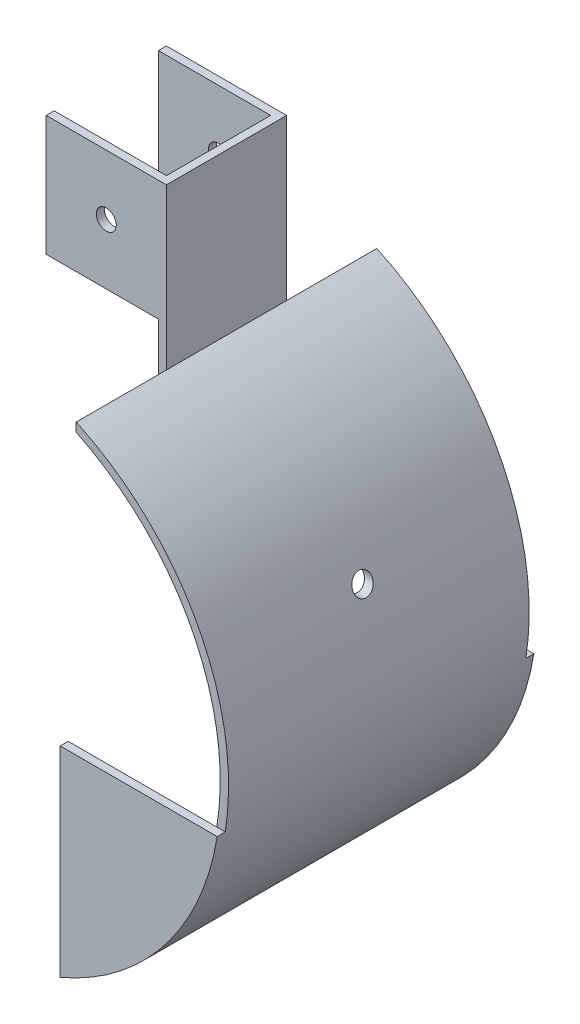
ISO-10303-21;
HEADER;
FILE_DESCRIPTION(('STEP AP214'),'2;1');
FILE_NAME('part.step','',(''),(''),'','','');
FILE_SCHEMA(('AUTOMOTIVE_DESIGN { 1 0 10303 214 1 1 1 1 }'));
ENDSEC;
DATA;
#1=APPLICATION_CONTEXT('core data for automotive mechanical design processes');
#2=APPLICATION_PROTOCOL_DEFINITION('international standard','automotive_design',2000,#1);
#3=PRODUCT_CONTEXT('',#1,'mechanical');
#4=PRODUCT('Part','Part','',(#3));
#5=PRODUCT_RELATED_PRODUCT_CATEGORY('part','',(#4));
#6=PRODUCT_DEFINITION_FORMATION('','',#4);
#7=PRODUCT_DEFINITION_CONTEXT('part definition',#1,'design');
#8=PRODUCT_DEFINITION('design','',#6,#7);
#9=PRODUCT_DEFINITION_SHAPE('','',#8);
#10=(LENGTH_UNIT() NAMED_UNIT(*) SI_UNIT(.MILLI.,.METRE.));
#11=(NAMED_UNIT(*) PLANE_ANGLE_UNIT() SI_UNIT($,.RADIAN.));
#12=(NAMED_UNIT(*) SI_UNIT($,.STERADIAN.) SOLID_ANGLE_UNIT());
#13=UNCERTAINTY_MEASURE_WITH_UNIT(LENGTH_MEASURE(1.E-05),#10,'distance_accuracy_value','');
#14=(GEOMETRIC_REPRESENTATION_CONTEXT(3) GLOBAL_UNCERTAINTY_ASSIGNED_CONTEXT((#13)) GLOBAL_UNIT_ASSIGNED_CONTEXT((#10,
#11,#12)) REPRESENTATION_CONTEXT('',''));
#15=CARTESIAN_POINT('',(0.,0.,0.));
#16=DIRECTION('',(0.,0.,1.));
#17=DIRECTION('',(1.,0.,0.));
#18=AXIS2_PLACEMENT_3D('',#15,#16,#17);
#19=CARTESIAN_POINT('',(0.,0.,0.));
#20=DIRECTION('',(0.,0.,1.));
#21=DIRECTION('',(1.,0.,0.));
#22=AXIS2_PLACEMENT_3D('',#19,#20,#21);
#23=PLANE('',#22);
#24=DIRECTION('',(1.,0.,0.));
#25=VECTOR('',#24,1.);
#26=CARTESIAN_POINT('',(13.,-94.9833321757651,6.93889390390723E-13));
#27=LINE('',#26,#25);
#28=CARTESIAN_POINT('',(50.0664199888695,-94.9833321757651,0.));
#29=VERTEX_POINT('',#28);
#30=CARTESIAN_POINT('',(52.1743790271769,-94.9833321757651,6.93889390390723E-13));
#31=VERTEX_POINT('',#30);
#32=EDGE_CURVE('E13',#29,#31,#27,.T.);
#33=ORIENTED_EDGE('',*,*,#32,.F.);
#34=CARTESIAN_POINT('',(-12.7808753095954,-84.5463493161086,0.));
#35=DIRECTION('',(0.,0.,1.));
#36=DIRECTION('',(1.,0.,0.));
#37=AXIS2_PLACEMENT_3D('',#34,#35,#36);
#38=CIRCLE('',#37,63.7080304007683);
#39=CARTESIAN_POINT('',(15.,-27.214542222856,0.));
#40=VERTEX_POINT('',#39);
#41=EDGE_CURVE('E346',#40,#29,#38,.F.);
#42=ORIENTED_EDGE('',*,*,#41,.F.);
#43=DIRECTION('',(0.,-1.,0.));
#44=VECTOR('',#43,1.);
#45=CARTESIAN_POINT('',(15.,0.,0.));
#46=LINE('',#45,#44);
#47=CARTESIAN_POINT('',(15.,-25.,0.));
#48=VERTEX_POINT('',#47);
#49=EDGE_CURVE('E376',#48,#40,#46,.T.);
#50=ORIENTED_EDGE('',*,*,#49,.F.);
#51=CARTESIAN_POINT('',(-12.6410256410256,-84.547587311974,0.));
#52=DIRECTION('',(0.,0.,1.));
#53=DIRECTION('',(1.,0.,0.));
#54=AXIS2_PLACEMENT_3D('',#51,#52,#53);
#55=CIRCLE('',#54,65.6501443499175);
#56=EDGE_CURVE('E71',#48,#31,#55,.F.);
#57=ORIENTED_EDGE('',*,*,#56,.T.);
#58=EDGE_LOOP('',(#33,#42,#50,#57));
#59=FACE_BOUND('',#58,.T.);
#60=ADVANCED_FACE('F46',(#59),#23,.F.);
#61=DIRECTION('',(0.,1.,0.));
#62=VECTOR('',#61,1.);
#63=CARTESIAN_POINT('',(13.,-144.983332175765,6.93889390390723E-13));
#64=LINE('',#63,#62);
#65=CARTESIAN_POINT('',(13.,-144.983332175765,6.93889390390723E-13));
#66=VERTEX_POINT('',#65);
#67=CARTESIAN_POINT('',(13.,-142.804907535621,6.93889390390723E-13));
#68=VERTEX_POINT('',#67);
#69=EDGE_CURVE('E540',#66,#68,#64,.T.);
#70=ORIENTED_EDGE('',*,*,#69,.F.);
#71=DIRECTION('',(-0.432481400809794,0.90164285498949,0.));
#72=VECTOR('',#71,1.);
#73=CARTESIAN_POINT('',(-45.9668685110869,-22.0484369997544,6.93889390390723E-13));
#74=LINE('',#73,#72);
#75=CARTESIAN_POINT('',(12.1350371983804,-143.180046465786,0.));
#76=VERTEX_POINT('',#75);
#77=EDGE_CURVE('E337',#66,#76,#74,.T.);
#78=ORIENTED_EDGE('',*,*,#77,.T.);
#79=EDGE_CURVE('E345',#68,#76,#38,.F.);
#80=ORIENTED_EDGE('',*,*,#79,.F.);
#81=EDGE_LOOP('',(#70,#78,#80));
#82=FACE_BOUND('',#81,.T.);
#83=ADVANCED_FACE('F408',(#82),#23,.F.);
#84=CARTESIAN_POINT('',(0.,0.,75.));
#85=DIRECTION('',(0.,0.,1.));
#86=DIRECTION('',(1.,0.,0.));
#87=AXIS2_PLACEMENT_3D('',#84,#85,#86);
#88=PLANE('',#87);
#89=DIRECTION('',(0.,-1.,0.));
#90=VECTOR('',#89,1.);
#91=CARTESIAN_POINT('',(13.,-144.983332175765,75.));
#92=LINE('',#91,#90);
#93=CARTESIAN_POINT('',(13.,-142.804907535621,75.));
#94=VERTEX_POINT('',#93);
#95=CARTESIAN_POINT('',(13.,-144.983332175765,75.));
#96=VERTEX_POINT('',#95);
#97=EDGE_CURVE('E59',#94,#96,#92,.T.);
#98=ORIENTED_EDGE('',*,*,#97,.F.);
#99=CARTESIAN_POINT('',(-12.7808753095955,-84.5463493161086,75.));
#100=DIRECTION('',(0.,0.,1.));
#101=DIRECTION('',(1.,0.,0.));
#102=AXIS2_PLACEMENT_3D('',#99,#100,#101);
#103=CIRCLE('',#102,63.7080304007683);
#104=CARTESIAN_POINT('',(12.1350371983804,-143.180046465786,75.));
#105=VERTEX_POINT('',#104);
#106=EDGE_CURVE('E336',#94,#105,#103,.F.);
#107=ORIENTED_EDGE('',*,*,#106,.T.);
#108=DIRECTION('',(-0.432481400809794,0.90164285498949,0.));
#109=VECTOR('',#108,1.);
#110=CARTESIAN_POINT('',(-45.9668685110869,-22.0484369997544,75.));
#111=LINE('',#110,#109);
#112=EDGE_CURVE('E340',#96,#105,#111,.T.);
#113=ORIENTED_EDGE('',*,*,#112,.F.);
#114=EDGE_LOOP('',(#98,#107,#113));
#115=FACE_BOUND('',#114,.T.);
#116=ADVANCED_FACE('F413',(#115),#88,.T.);
#117=CARTESIAN_POINT('',(0.,15.,75.));
#118=DIRECTION('',(0.,1.,0.));
#119=DIRECTION('',(0.,0.,1.));
#120=AXIS2_PLACEMENT_3D('',#117,#118,#119);
#121=PLANE('',#120);
#122=DIRECTION('',(0.,0.,-1.));
#123=VECTOR('',#122,1.);
#124=CARTESIAN_POINT('',(-15.,15.,75.0000000000007));
#125=LINE('',#124,#123);
#126=CARTESIAN_POINT('',(-15.,15.,24.5000000000007));
#127=VERTEX_POINT('',#126);
#128=CARTESIAN_POINT('',(-15.,15.,22.5000000000007));
#129=VERTEX_POINT('',#128);
#130=EDGE_CURVE('E367',#127,#129,#125,.T.);
#131=ORIENTED_EDGE('',*,*,#130,.F.);
#132=DIRECTION('',(1.,0.,0.));
#133=VECTOR('',#132,1.);
#134=CARTESIAN_POINT('',(0.,15.,24.5));
#135=LINE('',#134,#133);
#136=CARTESIAN_POINT('',(13.,15.,24.5000000000007));
#137=VERTEX_POINT('',#136);
#138=EDGE_CURVE('E285',#127,#137,#135,.T.);
#139=ORIENTED_EDGE('',*,*,#138,.T.);
#140=DIRECTION('',(0.,0.,1.));
#141=VECTOR('',#140,1.);
#142=CARTESIAN_POINT('',(13.,15.,75.));
#143=LINE('',#142,#141);
#144=CARTESIAN_POINT('',(13.,15.,50.5000000000007));
#145=VERTEX_POINT('',#144);
#146=EDGE_CURVE('E288',#137,#145,#143,.T.);
#147=ORIENTED_EDGE('',*,*,#146,.T.);
#148=DIRECTION('',(1.,0.,0.));
#149=VECTOR('',#148,1.);
#150=CARTESIAN_POINT('',(0.,15.,50.5));
#151=LINE('',#150,#149);
#152=CARTESIAN_POINT('',(-15.,15.,50.5000000000007));
#153=VERTEX_POINT('',#152);
#154=EDGE_CURVE('E280',#153,#145,#151,.T.);
#155=ORIENTED_EDGE('',*,*,#154,.F.);
#156=CARTESIAN_POINT('',(-15.,15.,52.5000000000007));
#157=VERTEX_POINT('',#156);
#158=EDGE_CURVE('E368',#157,#153,#125,.T.);
#159=ORIENTED_EDGE('',*,*,#158,.F.);
#160=DIRECTION('',(1.,0.,0.));
#161=VECTOR('',#160,1.);
#162=CARTESIAN_POINT('',(0.,15.,52.5));
#163=LINE('',#162,#161);
#164=CARTESIAN_POINT('',(15.,15.,52.5));
#165=VERTEX_POINT('',#164);
#166=EDGE_CURVE('E291',#157,#165,#163,.T.);
#167=ORIENTED_EDGE('',*,*,#166,.T.);
#168=DIRECTION('',(0.,0.,-1.));
#169=VECTOR('',#168,1.);
#170=CARTESIAN_POINT('',(15.,15.,75.));
#171=LINE('',#170,#169);
#172=CARTESIAN_POINT('',(15.,15.,22.5));
#173=VERTEX_POINT('',#172);
#174=EDGE_CURVE('E371',#165,#173,#171,.T.);
#175=ORIENTED_EDGE('',*,*,#174,.T.);
#176=DIRECTION('',(1.,0.,0.));
#177=VECTOR('',#176,1.);
#178=CARTESIAN_POINT('',(0.,15.,22.5));
#179=LINE('',#178,#177);
#180=EDGE_CURVE('E309',#129,#173,#179,.T.);
#181=ORIENTED_EDGE('',*,*,#180,.F.);
#182=EDGE_LOOP('',(#131,#139,#147,#155,#159,#167,#175,#181));
#183=FACE_BOUND('',#182,.T.);
#184=ADVANCED_FACE('F497',(#183),#121,.T.);
#185=CARTESIAN_POINT('',(-15.,0.,75.0000000000007));
#186=DIRECTION('',(-1.,0.,0.));
#187=DIRECTION('',(0.,0.,1.));
#188=AXIS2_PLACEMENT_3D('',#185,#186,#187);
#189=PLANE('',#188);
#190=DIRECTION('',(0.,0.,-1.));
#191=VECTOR('',#190,1.);
#192=CARTESIAN_POINT('',(-15.,-15.,75.0000000000007));
#193=LINE('',#192,#191);
#194=CARTESIAN_POINT('',(-15.,-15.,24.5000000000007));
#195=VERTEX_POINT('',#194);
#196=CARTESIAN_POINT('',(-15.,-15.,22.5000000000007));
#197=VERTEX_POINT('',#196);
#198=EDGE_CURVE('E363',#195,#197,#193,.T.);
#199=ORIENTED_EDGE('',*,*,#198,.F.);
#200=DIRECTION('',(0.,1.,0.));
#201=VECTOR('',#200,1.);
#202=CARTESIAN_POINT('',(-15.,0.,24.5000000000007));
#203=LINE('',#202,#201);
#204=EDGE_CURVE('E271',#195,#127,#203,.T.);
#205=ORIENTED_EDGE('',*,*,#204,.T.);
#206=ORIENTED_EDGE('',*,*,#130,.T.);
#207=DIRECTION('',(0.,1.,0.));
#208=VECTOR('',#207,1.);
#209=CARTESIAN_POINT('',(-15.,-60.,22.5000000000007));
#210=LINE('',#209,#208);
#211=EDGE_CURVE('E312',#197,#129,#210,.T.);
#212=ORIENTED_EDGE('',*,*,#211,.F.);
#213=EDGE_LOOP('',(#199,#205,#206,#212));
#214=FACE_BOUND('',#213,.T.);
#215=ADVANCED_FACE('F506',(#214),#189,.T.);
#216=CARTESIAN_POINT('',(0.,-15.,75.));
#217=DIRECTION('',(0.,1.,0.));
#218=DIRECTION('',(0.,0.,1.));
#219=AXIS2_PLACEMENT_3D('',#216,#217,#218);
#220=PLANE('',#219);
#221=DIRECTION('',(1.,0.,0.));
#222=VECTOR('',#221,1.);
#223=CARTESIAN_POINT('',(0.,-15.,24.5));
#224=LINE('',#223,#222);
#225=CARTESIAN_POINT('',(13.,-15.,24.5000000000007));
#226=VERTEX_POINT('',#225);
#227=EDGE_CURVE('E282',#195,#226,#224,.T.);
#228=ORIENTED_EDGE('',*,*,#227,.F.);
#229=ORIENTED_EDGE('',*,*,#198,.T.);
#230=DIRECTION('',(1.,0.,0.));
#231=VECTOR('',#230,1.);
#232=CARTESIAN_POINT('',(0.,-15.,22.5));
#233=LINE('',#232,#231);
#234=CARTESIAN_POINT('',(13.,-15.,22.5000000000007));
#235=VERTEX_POINT('',#234);
#236=EDGE_CURVE('E330',#197,#235,#233,.T.);
#237=ORIENTED_EDGE('',*,*,#236,.T.);
#238=DIRECTION('',(0.,0.,-1.));
#239=VECTOR('',#238,1.);
#240=CARTESIAN_POINT('',(13.,-15.,75.));
#241=LINE('',#240,#239);
#242=EDGE_CURVE('E359',#226,#235,#241,.T.);
#243=ORIENTED_EDGE('',*,*,#242,.F.);
#244=EDGE_LOOP('',(#228,#229,#237,#243));
#245=FACE_BOUND('',#244,.T.);
#246=ADVANCED_FACE('F429',(#245),#220,.F.);
#247=CARTESIAN_POINT('',(-12.7808753095955,-84.5463493161086,75.));
#248=DIRECTION('',(0.,0.,-1.));
#249=DIRECTION('',(-1.,0.,0.));
#250=AXIS2_PLACEMENT_3D('',#247,#248,#249);
#251=CYLINDRICAL_SURFACE('',#250,63.7080304007683);
#252=CARTESIAN_POINT('',(46.7334713441988,-61.8140885416667,40.));
#253=CARTESIAN_POINT('',(46.7894701649069,-61.9606988635637,39.9999947962429));
#254=CARTESIAN_POINT('',(46.8449624082653,-62.1076203184161,39.9870751491451));
#255=CARTESIAN_POINT('',(46.9534189086211,-62.3979562435051,39.9353399304944));
#256=CARTESIAN_POINT('',(47.0063802504389,-62.5413665810442,39.8964952329922));
#257=CARTESIAN_POINT('',(47.1083840777718,-62.8205154539782,39.7933093633442));
#258=CARTESIAN_POINT('',(47.157420693175,-62.9562424119617,39.7289308267866));
#259=CARTESIAN_POINT('',(47.2500918131756,-63.2152673354823,39.575887284567));
#260=CARTESIAN_POINT('',(47.2937285873373,-63.3385705186816,39.4872325329312));
#261=CARTESIAN_POINT('',(47.3727016824971,-63.5636423216117,39.2917524192339));
#262=CARTESIAN_POINT('',(47.408301756063,-63.6660788060038,39.1858039214783));
#263=CARTESIAN_POINT('',(47.4723219342659,-63.8515429062628,38.9562050684043));
#264=CARTESIAN_POINT('',(47.5007443701678,-63.9345768233412,38.8325604811924));
#265=CARTESIAN_POINT('',(47.5481059686948,-64.0736295607927,38.5789574687839));
#266=CARTESIAN_POINT('',(47.5675045133272,-64.1309498807151,38.449797907852));
#267=CARTESIAN_POINT('',(47.5986223703877,-64.2231657635252,38.1828394458782));
#268=CARTESIAN_POINT('',(47.6103440075497,-64.2580681149972,38.0450431740817));
#269=CARTESIAN_POINT('',(47.6254237048249,-64.3030117951379,37.7713567392913));
#270=CARTESIAN_POINT('',(47.6291314278325,-64.3140923907983,37.6356556109808));
#271=CARTESIAN_POINT('',(47.6291289032297,-64.3140846920712,37.3642633654066));
#272=CARTESIAN_POINT('',(47.6254196788532,-64.3029994556575,37.2285722493444));
#273=CARTESIAN_POINT('',(47.6108106026186,-64.2594590943198,36.9634231890153));
#274=CARTESIAN_POINT('',(47.6000322281498,-64.2273650064343,36.8338989104109));
#275=CARTESIAN_POINT('',(47.5716868128058,-64.1433266266442,36.5822590060522));
#276=CARTESIAN_POINT('',(47.5541195988798,-64.0913818287358,36.4601435692447));
#277=CARTESIAN_POINT('',(47.5123533804738,-63.9685954475406,36.2248725485849));
#278=CARTESIAN_POINT('',(47.4880663278868,-63.8975033363934,36.1118636154872));
#279=CARTESIAN_POINT('',(47.4335743515238,-63.7391345642402,35.8994507404649));
#280=CARTESIAN_POINT('',(47.4033685203263,-63.6518554216733,35.8000488886475));
#281=CARTESIAN_POINT('',(47.3364472350968,-63.4600655660875,35.6133712240197));
#282=CARTESIAN_POINT('',(47.299521136239,-63.3550087707836,35.5267326047947));
#283=CARTESIAN_POINT('',(47.2209309462347,-63.1334982307916,35.3722293845115));
#284=CARTESIAN_POINT('',(47.1792657206028,-63.0170417581027,35.3043692921918));
#285=CARTESIAN_POINT('',(47.0897498190222,-62.7693053934375,35.1853806578891));
#286=CARTESIAN_POINT('',(47.0416849990643,-62.6375625174215,35.1353773494199));
#287=CARTESIAN_POINT('',(46.9425106954159,-62.3686385202099,35.0582674837975));
#288=CARTESIAN_POINT('',(46.8914003826364,-62.2314559215643,35.0311671924091));
#289=CARTESIAN_POINT('',(46.7845668351138,-61.9477786399299,34.9992865217291));
#290=CARTESIAN_POINT('',(46.7287430719144,-61.8011782379249,34.9957770100198));
#291=CARTESIAN_POINT('',(46.6165533315577,-61.5097913035224,35.0142951968871));
#292=CARTESIAN_POINT('',(46.5601872319113,-61.3650051987406,35.036328805456));
#293=CARTESIAN_POINT('',(46.4468434087796,-61.0768983661361,35.1064319205144));
#294=CARTESIAN_POINT('',(46.3898965615724,-60.9337463749151,35.1552490939489));
#295=CARTESIAN_POINT('',(46.2789512008122,-60.6576032604867,35.2784248174774));
#296=CARTESIAN_POINT('',(46.2249527973993,-60.5246125167818,35.3527843209577));
#297=CARTESIAN_POINT('',(46.1227253775956,-60.2750311752,35.5241822483178));
#298=CARTESIAN_POINT('',(46.0744189258971,-60.1582153777688,35.620845264353));
#299=CARTESIAN_POINT('',(45.9846682715877,-59.9427384245732,35.8353296911883));
#300=CARTESIAN_POINT('',(45.9432214346043,-59.8440702977334,35.9531429430263));
#301=CARTESIAN_POINT('',(45.8716287288685,-59.6745809860345,36.1987185449149));
#302=CARTESIAN_POINT('',(45.8409316879483,-59.6023876378012,36.3253712457722));
#303=CARTESIAN_POINT('',(45.7889897958513,-59.4806665252184,36.5909162783386));
#304=CARTESIAN_POINT('',(45.7677391521789,-59.4311248704008,36.7298010466089));
#305=CARTESIAN_POINT('',(45.7372114974639,-59.3600825932991,37.0037618680546));
#306=CARTESIAN_POINT('',(45.7271090460465,-59.3366474171777,37.1382460916892));
#307=CARTESIAN_POINT('',(45.7164902071648,-59.3120163691573,37.40959537717));
#308=CARTESIAN_POINT('',(45.7159705612303,-59.310812937731,37.5464596138877));
#309=CARTESIAN_POINT('',(45.7243302500184,-59.3302007541771,37.8116510571419));
#310=CARTESIAN_POINT('',(45.7327568283818,-59.3497421314513,37.9400713140941));
#311=CARTESIAN_POINT('',(45.7578857179087,-59.4081792144796,38.1915686694685));
#312=CARTESIAN_POINT('',(45.7745880770488,-59.4470750324358,38.3146457369106));
#313=CARTESIAN_POINT('',(45.815709865501,-59.5432277701504,38.5535416432015));
#314=CARTESIAN_POINT('',(45.8402088861802,-59.6006741543841,38.6692701617244));
#315=CARTESIAN_POINT('',(45.8958220206181,-59.7317692606829,38.88937640539));
#316=CARTESIAN_POINT('',(45.9269373505425,-59.8054209615876,38.9937520383822));
#317=CARTESIAN_POINT('',(45.9966283423894,-59.9714280326456,39.1948727284626));
#318=CARTESIAN_POINT('',(46.0355364966024,-60.0646322429964,39.2908008455195));
#319=CARTESIAN_POINT('',(46.1180814648404,-60.2638935765805,39.4658334932415));
#320=CARTESIAN_POINT('',(46.1617209726735,-60.3699580259334,39.544928363121));
#321=CARTESIAN_POINT('',(46.255871631304,-60.6007372605364,39.6903866928935));
#322=CARTESIAN_POINT('',(46.3066532058372,-60.7262600319966,39.7552924999581));
#323=CARTESIAN_POINT('',(46.4104972028215,-60.9854917766854,39.8628580161735));
#324=CARTESIAN_POINT('',(46.4635577800123,-61.1191941629372,39.9055353689275));
#325=CARTESIAN_POINT('',(46.5529935485887,-61.3468908336766,39.9577571711386));
#326=CARTESIAN_POINT('',(46.5891542609142,-61.4395812562373,39.9735717289379));
#327=CARTESIAN_POINT('',(46.6614365486887,-61.6261679399227,39.9946950585801));
#328=CARTESIAN_POINT('',(46.6975581222209,-61.7200642574416,40.0000033372789));
#329=CARTESIAN_POINT('',(46.7334713441988,-61.8140885416667,40.));
#330=B_SPLINE_CURVE_WITH_KNOTS('',3,(#252,#253,#254,#255,#256,#257,#258,#259,#260,#261,#262,
#263,#264,#265,#266,#267,#268,#269,#270,#271,#272,#273,#274,#275,#276,#277,#278,#279,#280,#281,
#282,#283,#284,#285,#286,#287,#288,#289,#290,#291,#292,#293,#294,#295,#296,#297,#298,#299,#300,
#301,#302,#303,#304,#305,#306,#307,#308,#309,#310,#311,#312,#313,#314,#315,#316,#317,#318,#319,
#320,#321,#322,#323,#324,#325,#326,#327,#328,#329),.UNSPECIFIED.,.T.,.F.,(4,2,2,2,2,2,2,2,2,2,2,
2,2,2,2,2,2,2,2,2,2,2,2,2,2,2,2,2,2,2,2,2,2,2,2,2,2,2,4),(0.,0.470470350120564,0.94147015009329,
1.41316173587668,1.8846543904493,2.3371346167311,2.7894676898769,3.21520104393802,
3.64080541703952,4.04742995381473,4.4539983969867,4.85375716835018,5.25352613042859,
5.65880376855237,6.06414358940383,6.48555765118293,6.9070728071816,7.35176644433495,
7.79658170060381,8.26518018866145,8.73388711947418,9.2163978399021,9.6989265723529,
10.173859931322,10.648610471095,11.0931604671667,11.5374374895307,11.9459879995953,
12.354399586437,12.7430849866776,13.1317726402401,13.5245628111471,13.917425244628,
14.3335335544344,14.7498800332051,15.1984251067357,15.6466136076466,15.9483219809667,
16.2500445155525),.UNSPECIFIED.);
#331=CARTESIAN_POINT('',(46.7334713441988,-61.8140885416667,40.));
#332=VERTEX_POINT('',#331);
#333=EDGE_CURVE('E434',#332,#332,#330,.T.);
#334=ORIENTED_EDGE('',*,*,#333,.T.);
#335=EDGE_LOOP('',(#334));
#336=FACE_BOUND('',#335,.T.);
#337=DIRECTION('',(0.,0.,-1.));
#338=VECTOR('',#337,1.);
#339=CARTESIAN_POINT('',(15.,-27.214542222856,75.));
#340=LINE('',#339,#338);
#341=CARTESIAN_POINT('',(15.,-27.214542222856,52.5));
#342=VERTEX_POINT('',#341);
#343=CARTESIAN_POINT('',(15.,-27.214542222856,75.));
#344=VERTEX_POINT('',#343);
#345=EDGE_CURVE('E298',#342,#344,#340,.F.);
#346=ORIENTED_EDGE('',*,*,#345,.F.);
#347=CARTESIAN_POINT('',(-12.7808753095954,-84.5463493161086,52.5));
#348=DIRECTION('',(0.,0.,1.));
#349=DIRECTION('',(1.,0.,0.));
#350=AXIS2_PLACEMENT_3D('',#347,#348,#349);
#351=CIRCLE('',#350,63.7080304007683);
#352=CARTESIAN_POINT('',(14.1579294786102,-26.8140885416667,52.5));
#353=VERTEX_POINT('',#352);
#354=EDGE_CURVE('E307',#353,#342,#351,.F.);
#355=ORIENTED_EDGE('',*,*,#354,.F.);
#356=DIRECTION('',(0.,0.,-1.));
#357=VECTOR('',#356,1.);
#358=CARTESIAN_POINT('',(14.1579294786102,-26.8140885416667,75.));
#359=LINE('',#358,#357);
#360=CARTESIAN_POINT('',(14.1579294786102,-26.8140885416667,22.5));
#361=VERTEX_POINT('',#360);
#362=EDGE_CURVE('E355',#353,#361,#359,.T.);
#363=ORIENTED_EDGE('',*,*,#362,.T.);
#364=CARTESIAN_POINT('',(-12.7808753095954,-84.5463493161086,22.5));
#365=DIRECTION('',(0.,0.,1.));
#366=DIRECTION('',(1.,0.,0.));
#367=AXIS2_PLACEMENT_3D('',#364,#365,#366);
#368=CIRCLE('',#367,63.7080304007683);
#369=CARTESIAN_POINT('',(15.,-27.214542222856,22.5));
#370=VERTEX_POINT('',#369);
#371=EDGE_CURVE('E378',#361,#370,#368,.F.);
#372=ORIENTED_EDGE('',*,*,#371,.T.);
#373=DIRECTION('',(0.,0.,-1.));
#374=VECTOR('',#373,1.);
#375=CARTESIAN_POINT('',(15.,-27.214542222856,75.));
#376=LINE('',#375,#374);
#377=EDGE_CURVE('E319',#40,#370,#376,.F.);
#378=ORIENTED_EDGE('',*,*,#377,.F.);
#379=ORIENTED_EDGE('',*,*,#41,.T.);
#380=EDGE_CURVE('E348',#29,#68,#38,.F.);
#381=ORIENTED_EDGE('',*,*,#380,.T.);
#382=ORIENTED_EDGE('',*,*,#79,.T.);
#383=DIRECTION('',(0.,0.,-1.));
#384=VECTOR('',#383,1.);
#385=CARTESIAN_POINT('',(12.1350371983804,-143.180046465786,75.));
#386=LINE('',#385,#384);
#387=EDGE_CURVE('E352',#105,#76,#386,.T.);
#388=ORIENTED_EDGE('',*,*,#387,.F.);
#389=ORIENTED_EDGE('',*,*,#106,.F.);
#390=CARTESIAN_POINT('',(50.0664199888695,-94.9833321757651,75.));
#391=VERTEX_POINT('',#390);
#392=EDGE_CURVE('E341',#391,#94,#103,.F.);
#393=ORIENTED_EDGE('',*,*,#392,.F.);
#394=EDGE_CURVE('E338',#344,#391,#103,.F.);
#395=ORIENTED_EDGE('',*,*,#394,.F.);
#396=EDGE_LOOP('',(#346,#355,#363,#372,#378,#379,#381,#382,#388,#389,#393,#395));
#397=FACE_BOUND('',#396,.T.);
#398=ADVANCED_FACE('F424',(#336,#397),#251,.F.);
#399=CARTESIAN_POINT('',(15.,0.,75.));
#400=DIRECTION('',(1.,0.,0.));
#401=DIRECTION('',(0.,1.,0.));
#402=AXIS2_PLACEMENT_3D('',#399,#400,#401);
#403=PLANE('',#402);
#404=ORIENTED_EDGE('',*,*,#174,.F.);
#405=DIRECTION('',(0.,1.,0.));
#406=VECTOR('',#405,1.);
#407=CARTESIAN_POINT('',(15.,-60.,52.5));
#408=LINE('',#407,#406);
#409=CARTESIAN_POINT('',(15.,-25.,52.5));
#410=VERTEX_POINT('',#409);
#411=EDGE_CURVE('E294',#410,#165,#408,.T.);
#412=ORIENTED_EDGE('',*,*,#411,.F.);
#413=DIRECTION('',(0.,0.,-1.));
#414=VECTOR('',#413,1.);
#415=CARTESIAN_POINT('',(15.,-25.,75.));
#416=LINE('',#415,#414);
#417=CARTESIAN_POINT('',(15.,-25.,22.5));
#418=VERTEX_POINT('',#417);
#419=EDGE_CURVE('E373',#410,#418,#416,.T.);
#420=ORIENTED_EDGE('',*,*,#419,.T.);
#421=DIRECTION('',(0.,1.,0.));
#422=VECTOR('',#421,1.);
#423=CARTESIAN_POINT('',(15.,-60.,22.5));
#424=LINE('',#423,#422);
#425=EDGE_CURVE('E313',#418,#173,#424,.T.);
#426=ORIENTED_EDGE('',*,*,#425,.T.);
#427=EDGE_LOOP('',(#404,#412,#420,#426));
#428=FACE_BOUND('',#427,.T.);
#429=ADVANCED_FACE('F428',(#428),#403,.T.);
#430=DIRECTION('',(0.,1.,0.));
#431=VECTOR('',#430,1.);
#432=CARTESIAN_POINT('',(-15.,0.,50.5000000000007));
#433=LINE('',#432,#431);
#434=CARTESIAN_POINT('',(-15.,-15.,50.5000000000007));
#435=VERTEX_POINT('',#434);
#436=EDGE_CURVE('E266',#435,#153,#433,.T.);
#437=ORIENTED_EDGE('',*,*,#436,.F.);
#438=CARTESIAN_POINT('',(-15.,-15.,52.5000000000007));
#439=VERTEX_POINT('',#438);
#440=EDGE_CURVE('E364',#439,#435,#193,.T.);
#441=ORIENTED_EDGE('',*,*,#440,.F.);
#442=DIRECTION('',(0.,1.,0.));
#443=VECTOR('',#442,1.);
#444=CARTESIAN_POINT('',(-15.,-60.,52.5000000000007));
#445=LINE('',#444,#443);
#446=EDGE_CURVE('E295',#439,#157,#445,.T.);
#447=ORIENTED_EDGE('',*,*,#446,.T.);
#448=ORIENTED_EDGE('',*,*,#158,.T.);
#449=EDGE_LOOP('',(#437,#441,#447,#448));
#450=FACE_BOUND('',#449,.T.);
#451=ADVANCED_FACE('F521',(#450),#189,.T.);
#452=ORIENTED_EDGE('',*,*,#440,.T.);
#453=DIRECTION('',(1.,0.,0.));
#454=VECTOR('',#453,1.);
#455=CARTESIAN_POINT('',(0.,-15.,50.5));
#456=LINE('',#455,#454);
#457=CARTESIAN_POINT('',(13.,-15.,50.5000000000007));
#458=VERTEX_POINT('',#457);
#459=EDGE_CURVE('E274',#435,#458,#456,.T.);
#460=ORIENTED_EDGE('',*,*,#459,.T.);
#461=CARTESIAN_POINT('',(13.,-15.,52.5000000000007));
#462=VERTEX_POINT('',#461);
#463=EDGE_CURVE('E360',#462,#458,#241,.T.);
#464=ORIENTED_EDGE('',*,*,#463,.F.);
#465=DIRECTION('',(1.,0.,0.));
#466=VECTOR('',#465,1.);
#467=CARTESIAN_POINT('',(0.,-15.,52.5));
#468=LINE('',#467,#466);
#469=EDGE_CURVE('E305',#439,#462,#468,.T.);
#470=ORIENTED_EDGE('',*,*,#469,.F.);
#471=EDGE_LOOP('',(#452,#460,#464,#470));
#472=FACE_BOUND('',#471,.T.);
#473=ADVANCED_FACE('F517',(#472),#220,.F.);
#474=CARTESIAN_POINT('',(13.,0.,75.));
#475=DIRECTION('',(-1.,0.,0.));
#476=DIRECTION('',(0.,0.,1.));
#477=AXIS2_PLACEMENT_3D('',#474,#475,#476);
#478=PLANE('',#477);
#479=ORIENTED_EDGE('',*,*,#463,.T.);
#480=DIRECTION('',(0.,1.,0.));
#481=VECTOR('',#480,1.);
#482=CARTESIAN_POINT('',(13.,0.,50.5000000000007));
#483=LINE('',#482,#481);
#484=EDGE_CURVE('E267',#458,#145,#483,.T.);
#485=ORIENTED_EDGE('',*,*,#484,.T.);
#486=ORIENTED_EDGE('',*,*,#146,.F.);
#487=DIRECTION('',(0.,1.,0.));
#488=VECTOR('',#487,1.);
#489=CARTESIAN_POINT('',(13.,0.,24.5000000000007));
#490=LINE('',#489,#488);
#491=EDGE_CURVE('E270',#226,#137,#490,.T.);
#492=ORIENTED_EDGE('',*,*,#491,.F.);
#493=ORIENTED_EDGE('',*,*,#242,.T.);
#494=DIRECTION('',(0.,1.,0.));
#495=VECTOR('',#494,1.);
#496=CARTESIAN_POINT('',(13.,0.,22.5000000000007));
#497=LINE('',#496,#495);
#498=CARTESIAN_POINT('',(13.,-26.8140885416667,22.5000000000007));
#499=VERTEX_POINT('',#498);
#500=EDGE_CURVE('E327',#499,#235,#497,.T.);
#501=ORIENTED_EDGE('',*,*,#500,.F.);
#502=DIRECTION('',(0.,0.,-1.));
#503=VECTOR('',#502,1.);
#504=CARTESIAN_POINT('',(13.,-26.8140885416667,75.));
#505=LINE('',#504,#503);
#506=CARTESIAN_POINT('',(13.,-26.8140885416667,52.5000000000007));
#507=VERTEX_POINT('',#506);
#508=EDGE_CURVE('E357',#507,#499,#505,.T.);
#509=ORIENTED_EDGE('',*,*,#508,.F.);
#510=DIRECTION('',(0.,1.,0.));
#511=VECTOR('',#510,1.);
#512=CARTESIAN_POINT('',(13.,0.,52.5000000000007));
#513=LINE('',#512,#511);
#514=EDGE_CURVE('E302',#507,#462,#513,.T.);
#515=ORIENTED_EDGE('',*,*,#514,.T.);
#516=EDGE_LOOP('',(#479,#485,#486,#492,#493,#501,#509,#515));
#517=FACE_BOUND('',#516,.T.);
#518=ADVANCED_FACE('F512',(#517),#478,.T.);
#519=CARTESIAN_POINT('',(0.,-26.8140885416667,75.));
#520=DIRECTION('',(0.,-1.,0.));
#521=DIRECTION('',(0.,0.,-1.));
#522=AXIS2_PLACEMENT_3D('',#519,#520,#521);
#523=PLANE('',#522);
#524=ORIENTED_EDGE('',*,*,#362,.F.);
#525=DIRECTION('',(-1.,0.,0.));
#526=VECTOR('',#525,1.);
#527=CARTESIAN_POINT('',(0.,-26.8140885416667,52.5));
#528=LINE('',#527,#526);
#529=EDGE_CURVE('E384',#353,#507,#528,.T.);
#530=ORIENTED_EDGE('',*,*,#529,.T.);
#531=ORIENTED_EDGE('',*,*,#508,.T.);
#532=DIRECTION('',(-1.,0.,0.));
#533=VECTOR('',#532,1.);
#534=CARTESIAN_POINT('',(0.,-26.8140885416667,22.5));
#535=LINE('',#534,#533);
#536=EDGE_CURVE('E324',#361,#499,#535,.T.);
#537=ORIENTED_EDGE('',*,*,#536,.F.);
#538=EDGE_LOOP('',(#524,#530,#531,#537));
#539=FACE_BOUND('',#538,.T.);
#540=ADVANCED_FACE('F431',(#539),#523,.T.);
#541=DIRECTION('',(-1.,0.,0.));
#542=VECTOR('',#541,1.);
#543=CARTESIAN_POINT('',(13.,-94.9833321757651,75.));
#544=LINE('',#543,#542);
#545=CARTESIAN_POINT('',(52.1743790271769,-94.9833321757651,75.0000000000007));
#546=VERTEX_POINT('',#545);
#547=EDGE_CURVE('E231',#546,#391,#544,.T.);
#548=ORIENTED_EDGE('',*,*,#547,.F.);
#549=CARTESIAN_POINT('',(-12.6410256410256,-84.547587311974,75.));
#550=DIRECTION('',(0.,0.,1.));
#551=DIRECTION('',(1.,0.,0.));
#552=AXIS2_PLACEMENT_3D('',#549,#550,#551);
#553=CIRCLE('',#552,65.6501443499175);
#554=CARTESIAN_POINT('',(15.,-25.,75.));
#555=VERTEX_POINT('',#554);
#556=EDGE_CURVE('E333',#555,#546,#553,.F.);
#557=ORIENTED_EDGE('',*,*,#556,.F.);
#558=DIRECTION('',(0.,-1.,0.));
#559=VECTOR('',#558,1.);
#560=CARTESIAN_POINT('',(15.,0.,75.));
#561=LINE('',#560,#559);
#562=EDGE_CURVE('E381',#555,#344,#561,.T.);
#563=ORIENTED_EDGE('',*,*,#562,.T.);
#564=ORIENTED_EDGE('',*,*,#394,.T.);
#565=EDGE_LOOP('',(#548,#557,#563,#564));
#566=FACE_BOUND('',#565,.T.);
#567=ADVANCED_FACE('F417',(#566),#88,.T.);
#568=CARTESIAN_POINT('',(-12.6410256410256,-84.547587311974,75.));
#569=DIRECTION('',(0.,0.,-1.));
#570=DIRECTION('',(-1.,0.,0.));
#571=AXIS2_PLACEMENT_3D('',#568,#569,#570);
#572=CYLINDRICAL_SURFACE('',#571,65.6501443499175);
#573=CARTESIAN_POINT('',(48.9473619561946,-61.8140885416667,40.0000000000007));
#574=CARTESIAN_POINT('',(49.0013266445976,-61.9602890154139,39.9999947353673));
#575=CARTESIAN_POINT('',(49.0548045323013,-62.1067851583781,39.9871464150349));
#576=CARTESIAN_POINT('',(49.1593242433015,-62.3962452700361,39.9357218227143));
#577=CARTESIAN_POINT('',(49.2103632632942,-62.5392050871044,39.8971166728205));
#578=CARTESIAN_POINT('',(49.3086622101141,-62.8174372469325,39.7946215854268));
#579=CARTESIAN_POINT('',(49.3559169827892,-62.9526990348252,39.7306978451386));
#580=CARTESIAN_POINT('',(49.4452379195362,-63.2108583862679,39.5788086873562));
#581=CARTESIAN_POINT('',(49.4873061855512,-63.3337609549097,39.4908530560909));
#582=CARTESIAN_POINT('',(49.5635887591756,-63.5585190634392,39.2967139824087));
#583=CARTESIAN_POINT('',(49.5980384691241,-63.6609911293165,39.1913379681138));
#584=CARTESIAN_POINT('',(49.6600318116156,-63.846638077547,38.963000509765));
#585=CARTESIAN_POINT('',(49.6875774961015,-63.9298186929547,38.8400443078148));
#586=CARTESIAN_POINT('',(49.7336350977243,-64.0695920887497,38.5873785786771));
#587=CARTESIAN_POINT('',(49.7525613588399,-64.1273979384758,38.4584151750841));
#588=CARTESIAN_POINT('',(49.7829895590904,-64.2206050811839,38.191810003409));
#589=CARTESIAN_POINT('',(49.7944936019399,-64.2560127225407,38.054170706528));
#590=CARTESIAN_POINT('',(49.8094307633871,-64.3020320051038,37.7803589125051));
#591=CARTESIAN_POINT('',(49.8131825062585,-64.3136224306055,37.6443675182429));
#592=CARTESIAN_POINT('',(49.8134755606604,-64.3145268333169,37.3723116626714));
#593=CARTESIAN_POINT('',(49.8100178187492,-64.3038437348954,37.2362472132986));
#594=CARTESIAN_POINT('',(49.7960991616802,-64.2609565844774,36.9701813763081));
#595=CARTESIAN_POINT('',(49.7857512000657,-64.2290996566689,36.8401178079766));
#596=CARTESIAN_POINT('',(49.7584322704708,-64.1453562827282,36.5873565100123));
#597=CARTESIAN_POINT('',(49.7414611543008,-64.0934693884363,36.4646589452608));
#598=CARTESIAN_POINT('',(49.7010632707699,-63.9706678675275,36.2283386300171));
#599=CARTESIAN_POINT('',(49.6775573536242,-63.8995202506663,36.114850717818));
#600=CARTESIAN_POINT('',(49.6247644134835,-63.7408620734725,35.901492279757));
#601=CARTESIAN_POINT('',(49.5954765567267,-63.6533491533418,35.8016237213362));
#602=CARTESIAN_POINT('',(49.5306218012843,-63.4611379150662,35.6142911180546));
#603=CARTESIAN_POINT('',(49.494862156796,-63.3559221977336,35.5274252497649));
#604=CARTESIAN_POINT('',(49.4187199264623,-63.1339655987239,35.3725001411428));
#605=CARTESIAN_POINT('',(49.3783362909073,-63.0172221009127,35.3044451831649));
#606=CARTESIAN_POINT('',(49.2916852221307,-62.7691831642288,35.1853332451865));
#607=CARTESIAN_POINT('',(49.2452216242609,-62.6374475585562,35.1353357461002));
#608=CARTESIAN_POINT('',(49.1493357896998,-62.3684735661533,35.0582288425416));
#609=CARTESIAN_POINT('',(49.0999127887459,-62.2312337610174,35.0311253779665));
#610=CARTESIAN_POINT('',(48.9967628345476,-61.9478456180661,34.9993117747235));
#611=CARTESIAN_POINT('',(48.9429443820063,-61.8015960042978,34.9957945085157));
#612=CARTESIAN_POINT('',(48.8347883352591,-61.5108812907471,35.0141820799152));
#613=CARTESIAN_POINT('',(48.7804506308651,-61.3664165853469,35.0360924378044));
#614=CARTESIAN_POINT('',(48.6712959875874,-61.0792062438079,35.1057616880876));
#615=CARTESIAN_POINT('',(48.6165071612381,-60.9366178979794,35.1542167923344));
#616=CARTESIAN_POINT('',(48.5097700335296,-60.6615364807678,35.2764279119233));
#617=CARTESIAN_POINT('',(48.4578218213592,-60.5290437263116,35.3501847211521));
#618=CARTESIAN_POINT('',(48.3594157950551,-60.2802171500902,35.5202007086901));
#619=CARTESIAN_POINT('',(48.3128881771962,-60.1636734308432,35.6161111671709));
#620=CARTESIAN_POINT('',(48.2264044106543,-59.9485859023142,35.8288470059959));
#621=CARTESIAN_POINT('',(48.1864459453261,-59.8500357461483,35.9456649827111));
#622=CARTESIAN_POINT('',(48.1171871246199,-59.6801593008516,36.1896141822496));
#623=CARTESIAN_POINT('',(48.0873943966444,-59.60756292907,36.3157195220612));
#624=CARTESIAN_POINT('',(48.0368826314673,-59.484919177863,36.5801247999504));
#625=CARTESIAN_POINT('',(48.0161584841592,-59.4348590988738,36.7184178174018));
#626=CARTESIAN_POINT('',(47.9861362967576,-59.3624704307981,36.991996116646));
#627=CARTESIAN_POINT('',(47.9760955453328,-59.3383379111297,37.1267241048059));
#628=CARTESIAN_POINT('',(47.9653087755631,-59.3124155698641,37.3986662726228));
#629=CARTESIAN_POINT('',(47.9645597605433,-59.3106185448534,37.5358796364242));
#630=CARTESIAN_POINT('',(47.9722099300363,-59.3289988382823,37.8022179469475));
#631=CARTESIAN_POINT('',(47.9801921972388,-59.3481747000874,37.9314257647794));
#632=CARTESIAN_POINT('',(48.0042534856298,-59.4061365367195,38.1845633526168));
#633=CARTESIAN_POINT('',(48.0203325178532,-59.444922538273,38.3084931154287));
#634=CARTESIAN_POINT('',(48.060030506623,-59.5410692323389,38.548955946165));
#635=CARTESIAN_POINT('',(48.0837174947587,-59.5985975913309,38.6654104413963));
#636=CARTESIAN_POINT('',(48.1375817564943,-59.7301061726497,38.8869471314765));
#637=CARTESIAN_POINT('',(48.1677601416855,-59.8040892127617,38.9920273739519));
#638=CARTESIAN_POINT('',(48.2352983737899,-59.9707053719032,39.1941133309576));
#639=CARTESIAN_POINT('',(48.2729625893642,-60.0641422920259,39.2903536244219));
#640=CARTESIAN_POINT('',(48.3529205499599,-60.2640215790883,39.4659627647416));
#641=CARTESIAN_POINT('',(48.3952168539049,-60.3704711384656,39.5453222140943));
#642=CARTESIAN_POINT('',(48.4863029411444,-60.601655083506,39.6908890019903));
#643=CARTESIAN_POINT('',(48.5353412219702,-60.727155914454,39.7557228899171));
#644=CARTESIAN_POINT('',(48.635643166227,-60.9863780891592,39.8631667928963));
#645=CARTESIAN_POINT('',(48.6869049906982,-61.1200926765154,39.9057948073004));
#646=CARTESIAN_POINT('',(48.7732594418264,-61.3476594186721,39.9578972446887));
#647=CARTESIAN_POINT('',(48.808141073471,-61.4402021626869,39.9736598165123));
#648=CARTESIAN_POINT('',(48.8778693396471,-61.6264854603424,39.9947131149582));
#649=CARTESIAN_POINT('',(48.9127159725682,-61.7202260666017,40.0000033799591));
#650=CARTESIAN_POINT('',(48.9473619561946,-61.8140885416667,40.0000000000007));
#651=B_SPLINE_CURVE_WITH_KNOTS('',3,(#573,#574,#575,#576,#577,#578,#579,#580,#581,#582,#583,
#584,#585,#586,#587,#588,#589,#590,#591,#592,#593,#594,#595,#596,#597,#598,#599,#600,#601,#602,
#603,#604,#605,#606,#607,#608,#609,#610,#611,#612,#613,#614,#615,#616,#617,#618,#619,#620,#621,
#622,#623,#624,#625,#626,#627,#628,#629,#630,#631,#632,#633,#634,#635,#636,#637,#638,#639,#640,
#641,#642,#643,#644,#645,#646,#647,#648,#649,#650),.UNSPECIFIED.,.T.,.F.,(4,2,2,2,2,2,2,2,2,2,2,
2,2,2,2,2,2,2,2,2,2,2,2,2,2,2,2,2,2,2,2,2,2,2,2,2,2,2,4),(0.,0.467175293260597,0.93487525381206,
1.40320175572226,1.87133782995672,2.3219150752532,2.77235824543096,3.19796604610832,
3.62345316168921,4.03107349635823,4.43864031650032,4.83968505977491,5.24073877672854,
5.64687923827966,6.05307830855393,6.47435779812659,6.89573311427192,7.33887217804962,
7.78212617974556,8.24763904523117,8.71325299145565,9.19170810782396,9.670178237958,
10.1415761384379,10.6128074397717,11.0560261729687,11.498994831678,11.9086168445424,
12.31810674691,12.708864519485,13.0996228246229,13.4939774663133,13.8883996914096,
14.3045844683743,14.7210003309778,15.1676534318678,15.6139439248598,15.9138629018123,
16.2137950989572),.UNSPECIFIED.);
#652=CARTESIAN_POINT('',(48.9473619561946,-61.8140885416667,40.0000000000007));
#653=VERTEX_POINT('',#652);
#654=EDGE_CURVE('E51',#653,#653,#651,.T.);
#655=ORIENTED_EDGE('',*,*,#654,.F.);
#656=EDGE_LOOP('',(#655));
#657=FACE_BOUND('',#656,.T.);
#658=ORIENTED_EDGE('',*,*,#56,.F.);
#659=DIRECTION('',(0.,0.,-1.));
#660=VECTOR('',#659,1.);
#661=CARTESIAN_POINT('',(15.,-25.,75.));
#662=LINE('',#661,#660);
#663=EDGE_CURVE('E321',#48,#418,#662,.F.);
#664=ORIENTED_EDGE('',*,*,#663,.T.);
#665=ORIENTED_EDGE('',*,*,#419,.F.);
#666=EDGE_CURVE('E374',#555,#410,#416,.T.);
#667=ORIENTED_EDGE('',*,*,#666,.F.);
#668=ORIENTED_EDGE('',*,*,#556,.T.);
#669=DIRECTION('',(0.,0.,-1.));
#670=VECTOR('',#669,1.);
#671=CARTESIAN_POINT('',(52.1743790271769,-94.9833321757651,77.0000000000007));
#672=LINE('',#671,#670);
#673=CARTESIAN_POINT('',(52.1743790271769,-94.9833321757651,77.0000000000007));
#674=VERTEX_POINT('',#673);
#675=EDGE_CURVE('E253',#674,#546,#672,.T.);
#676=ORIENTED_EDGE('',*,*,#675,.F.);
#677=CARTESIAN_POINT('',(-12.6410256410259,-84.5475873119737,77.));
#678=DIRECTION('',(0.,0.,1.));
#679=DIRECTION('',(-1.,0.,0.));
#680=AXIS2_PLACEMENT_3D('',#677,#678,#679);
#681=CIRCLE('',#680,65.6501443499178);
#682=CARTESIAN_POINT('',(13.,-144.983332175765,77.));
#683=VERTEX_POINT('',#682);
#684=EDGE_CURVE('E237',#683,#674,#681,.T.);
#685=ORIENTED_EDGE('',*,*,#684,.F.);
#686=DIRECTION('',(0.,0.,-1.));
#687=VECTOR('',#686,1.);
#688=CARTESIAN_POINT('',(13.,-144.983332175765,77.));
#689=LINE('',#688,#687);
#690=EDGE_CURVE('E244',#683,#96,#689,.T.);
#691=ORIENTED_EDGE('',*,*,#690,.T.);
#692=DIRECTION('',(0.,0.,-1.));
#693=VECTOR('',#692,1.);
#694=CARTESIAN_POINT('',(13.,-144.983332175765,75.));
#695=LINE('',#694,#693);
#696=EDGE_CURVE('E227',#96,#66,#695,.T.);
#697=ORIENTED_EDGE('',*,*,#696,.T.);
#698=DIRECTION('',(0.,0.,1.));
#699=VECTOR('',#698,1.);
#700=CARTESIAN_POINT('',(13.,-144.983332175765,-1.99999999999931));
#701=LINE('',#700,#699);
#702=CARTESIAN_POINT('',(13.,-144.983332175765,-1.99999999999931));
#703=VERTEX_POINT('',#702);
#704=EDGE_CURVE('E211',#703,#66,#701,.T.);
#705=ORIENTED_EDGE('',*,*,#704,.F.);
#706=CARTESIAN_POINT('',(-12.6410256410256,-84.5475873119739,-2.));
#707=DIRECTION('',(0.,0.,-1.));
#708=DIRECTION('',(-1.,0.,0.));
#709=AXIS2_PLACEMENT_3D('',#706,#707,#708);
#710=CIRCLE('',#709,65.6501443499174);
#711=CARTESIAN_POINT('',(52.1743790271769,-94.9833321757651,-1.99999999999931));
#712=VERTEX_POINT('',#711);
#713=EDGE_CURVE('E217',#712,#703,#710,.T.);
#714=ORIENTED_EDGE('',*,*,#713,.F.);
#715=DIRECTION('',(0.,0.,1.));
#716=VECTOR('',#715,1.);
#717=CARTESIAN_POINT('',(52.1743790271769,-94.9833321757651,-1.99999999999931));
#718=LINE('',#717,#716);
#719=EDGE_CURVE('E233',#712,#31,#718,.T.);
#720=ORIENTED_EDGE('',*,*,#719,.T.);
#721=EDGE_LOOP('',(#658,#664,#665,#667,#668,#676,#685,#691,#697,#705,#714,#720));
#722=FACE_BOUND('',#721,.T.);
#723=ADVANCED_FACE('F48',(#657,#722),#572,.T.);
#724=CARTESIAN_POINT('',(-45.9668685110869,-22.0484369997544,75.));
#725=DIRECTION('',(-0.90164285498949,-0.432481400809794,0.));
#726=DIRECTION('',(0.432481400809794,-0.90164285498949,0.));
#727=AXIS2_PLACEMENT_3D('',#724,#725,#726);
#728=PLANE('',#727);
#729=ORIENTED_EDGE('',*,*,#77,.F.);
#730=ORIENTED_EDGE('',*,*,#696,.F.);
#731=ORIENTED_EDGE('',*,*,#112,.T.);
#732=ORIENTED_EDGE('',*,*,#387,.T.);
#733=EDGE_LOOP('',(#729,#730,#731,#732));
#734=FACE_BOUND('',#733,.T.);
#735=ADVANCED_FACE('F419',(#734),#728,.T.);
#736=CARTESIAN_POINT('',(0.,-60.,22.5));
#737=DIRECTION('',(0.,0.,1.));
#738=DIRECTION('',(1.,0.,0.));
#739=AXIS2_PLACEMENT_3D('',#736,#737,#738);
#740=PLANE('',#739);
#741=CARTESIAN_POINT('',(0.,0.,22.5));
#742=DIRECTION('',(0.,0.,1.));
#743=DIRECTION('',(1.,0.,0.));
#744=AXIS2_PLACEMENT_3D('',#741,#742,#743);
#745=CIRCLE('',#744,2.5);
#746=CARTESIAN_POINT('',(2.5,0.,22.5));
#747=VERTEX_POINT('',#746);
#748=EDGE_CURVE('E263',#747,#747,#745,.T.);
#749=ORIENTED_EDGE('',*,*,#748,.T.);
#750=EDGE_LOOP('',(#749));
#751=FACE_BOUND('',#750,.T.);
#752=ORIENTED_EDGE('',*,*,#211,.T.);
#753=ORIENTED_EDGE('',*,*,#180,.T.);
#754=ORIENTED_EDGE('',*,*,#425,.F.);
#755=EDGE_CURVE('E316',#370,#418,#424,.T.);
#756=ORIENTED_EDGE('',*,*,#755,.F.);
#757=ORIENTED_EDGE('',*,*,#371,.F.);
#758=ORIENTED_EDGE('',*,*,#536,.T.);
#759=ORIENTED_EDGE('',*,*,#500,.T.);
#760=ORIENTED_EDGE('',*,*,#236,.F.);
#761=EDGE_LOOP('',(#752,#753,#754,#756,#757,#758,#759,#760));
#762=FACE_BOUND('',#761,.T.);
#763=ADVANCED_FACE('F422',(#751,#762),#740,.F.);
#764=CARTESIAN_POINT('',(15.,-60.,0.));
#765=DIRECTION('',(-1.,0.,0.));
#766=DIRECTION('',(0.,0.,1.));
#767=AXIS2_PLACEMENT_3D('',#764,#765,#766);
#768=PLANE('',#767);
#769=ORIENTED_EDGE('',*,*,#49,.T.);
#770=ORIENTED_EDGE('',*,*,#377,.T.);
#771=ORIENTED_EDGE('',*,*,#755,.T.);
#772=ORIENTED_EDGE('',*,*,#663,.F.);
#773=EDGE_LOOP('',(#769,#770,#771,#772));
#774=FACE_BOUND('',#773,.T.);
#775=ADVANCED_FACE('F547',(#774),#768,.T.);
#776=CARTESIAN_POINT('',(0.,-60.,52.5));
#777=DIRECTION('',(0.,0.,1.));
#778=DIRECTION('',(1.,0.,0.));
#779=AXIS2_PLACEMENT_3D('',#776,#777,#778);
#780=PLANE('',#779);
#781=CARTESIAN_POINT('',(0.,0.,52.5));
#782=DIRECTION('',(0.,0.,1.));
#783=DIRECTION('',(1.,0.,0.));
#784=AXIS2_PLACEMENT_3D('',#781,#782,#783);
#785=CIRCLE('',#784,2.5);
#786=CARTESIAN_POINT('',(2.5,0.,52.5));
#787=VERTEX_POINT('',#786);
#788=EDGE_CURVE('E256',#787,#787,#785,.T.);
#789=ORIENTED_EDGE('',*,*,#788,.F.);
#790=EDGE_LOOP('',(#789));
#791=FACE_BOUND('',#790,.T.);
#792=ORIENTED_EDGE('',*,*,#354,.T.);
#793=EDGE_CURVE('E299',#342,#410,#408,.T.);
#794=ORIENTED_EDGE('',*,*,#793,.T.);
#795=ORIENTED_EDGE('',*,*,#411,.T.);
#796=ORIENTED_EDGE('',*,*,#166,.F.);
#797=ORIENTED_EDGE('',*,*,#446,.F.);
#798=ORIENTED_EDGE('',*,*,#469,.T.);
#799=ORIENTED_EDGE('',*,*,#514,.F.);
#800=ORIENTED_EDGE('',*,*,#529,.F.);
#801=EDGE_LOOP('',(#792,#794,#795,#796,#797,#798,#799,#800));
#802=FACE_BOUND('',#801,.T.);
#803=ADVANCED_FACE('F489',(#791,#802),#780,.T.);
#804=CARTESIAN_POINT('',(15.,-60.,0.));
#805=DIRECTION('',(-1.,0.,0.));
#806=DIRECTION('',(0.,0.,1.));
#807=AXIS2_PLACEMENT_3D('',#804,#805,#806);
#808=PLANE('',#807);
#809=ORIENTED_EDGE('',*,*,#345,.T.);
#810=ORIENTED_EDGE('',*,*,#562,.F.);
#811=ORIENTED_EDGE('',*,*,#666,.T.);
#812=ORIENTED_EDGE('',*,*,#793,.F.);
#813=EDGE_LOOP('',(#809,#810,#811,#812));
#814=FACE_BOUND('',#813,.T.);
#815=ADVANCED_FACE('F485',(#814),#808,.T.);
#816=CARTESIAN_POINT('',(13.,0.,24.5000000000007));
#817=DIRECTION('',(0.,0.,1.));
#818=DIRECTION('',(1.,0.,0.));
#819=AXIS2_PLACEMENT_3D('',#816,#817,#818);
#820=PLANE('',#819);
#821=CARTESIAN_POINT('',(0.,0.,24.5));
#822=DIRECTION('',(0.,0.,1.));
#823=DIRECTION('',(1.,0.,0.));
#824=AXIS2_PLACEMENT_3D('',#821,#822,#823);
#825=CIRCLE('',#824,2.5);
#826=CARTESIAN_POINT('',(2.5,0.,24.5));
#827=VERTEX_POINT('',#826);
#828=EDGE_CURVE('E260',#827,#827,#825,.T.);
#829=ORIENTED_EDGE('',*,*,#828,.F.);
#830=EDGE_LOOP('',(#829));
#831=FACE_BOUND('',#830,.T.);
#832=ORIENTED_EDGE('',*,*,#204,.F.);
#833=ORIENTED_EDGE('',*,*,#227,.T.);
#834=ORIENTED_EDGE('',*,*,#491,.T.);
#835=ORIENTED_EDGE('',*,*,#138,.F.);
#836=EDGE_LOOP('',(#832,#833,#834,#835));
#837=FACE_BOUND('',#836,.T.);
#838=ADVANCED_FACE('F403',(#831,#837),#820,.T.);
#839=CARTESIAN_POINT('',(13.,0.,50.5000000000007));
#840=DIRECTION('',(0.,0.,1.));
#841=DIRECTION('',(1.,0.,0.));
#842=AXIS2_PLACEMENT_3D('',#839,#840,#841);
#843=PLANE('',#842);
#844=CARTESIAN_POINT('',(0.,0.,50.5));
#845=DIRECTION('',(0.,0.,1.));
#846=DIRECTION('',(1.,0.,0.));
#847=AXIS2_PLACEMENT_3D('',#844,#845,#846);
#848=CIRCLE('',#847,2.5);
#849=CARTESIAN_POINT('',(2.5,0.,50.5));
#850=VERTEX_POINT('',#849);
#851=EDGE_CURVE('E259',#850,#850,#848,.T.);
#852=ORIENTED_EDGE('',*,*,#851,.T.);
#853=EDGE_LOOP('',(#852));
#854=FACE_BOUND('',#853,.T.);
#855=ORIENTED_EDGE('',*,*,#154,.T.);
#856=ORIENTED_EDGE('',*,*,#484,.F.);
#857=ORIENTED_EDGE('',*,*,#459,.F.);
#858=ORIENTED_EDGE('',*,*,#436,.T.);
#859=EDGE_LOOP('',(#855,#856,#857,#858));
#860=FACE_BOUND('',#859,.T.);
#861=ADVANCED_FACE('F389',(#854,#860),#843,.F.);
#862=CARTESIAN_POINT('',(0.,0.,14.5));
#863=DIRECTION('',(0.,0.,1.));
#864=DIRECTION('',(1.,0.,0.));
#865=AXIS2_PLACEMENT_3D('',#862,#863,#864);
#866=CYLINDRICAL_SURFACE('',#865,2.5);
#867=ORIENTED_EDGE('',*,*,#788,.T.);
#868=EDGE_LOOP('',(#867));
#869=FACE_BOUND('',#868,.T.);
#870=ORIENTED_EDGE('',*,*,#851,.F.);
#871=EDGE_LOOP('',(#870));
#872=FACE_BOUND('',#871,.T.);
#873=ADVANCED_FACE('F392',(#869,#872),#866,.F.);
#874=ORIENTED_EDGE('',*,*,#828,.T.);
#875=EDGE_LOOP('',(#874));
#876=FACE_BOUND('',#875,.T.);
#877=ORIENTED_EDGE('',*,*,#748,.F.);
#878=EDGE_LOOP('',(#877));
#879=FACE_BOUND('',#878,.T.);
#880=ADVANCED_FACE('F394',(#876,#879),#866,.F.);
#881=CARTESIAN_POINT('',(13.,-94.9833321757651,77.));
#882=DIRECTION('',(0.,-1.,0.));
#883=DIRECTION('',(0.,0.,-1.));
#884=AXIS2_PLACEMENT_3D('',#881,#882,#883);
#885=PLANE('',#884);
#886=ORIENTED_EDGE('',*,*,#547,.T.);
#887=CARTESIAN_POINT('',(13.,-94.9833321757651,75.));
#888=VERTEX_POINT('',#887);
#889=EDGE_CURVE('E229',#391,#888,#544,.T.);
#890=ORIENTED_EDGE('',*,*,#889,.T.);
#891=DIRECTION('',(0.,0.,-1.));
#892=VECTOR('',#891,1.);
#893=CARTESIAN_POINT('',(13.,-94.9833321757651,77.));
#894=LINE('',#893,#892);
#895=CARTESIAN_POINT('',(13.,-94.9833321757651,77.));
#896=VERTEX_POINT('',#895);
#897=EDGE_CURVE('E250',#896,#888,#894,.T.);
#898=ORIENTED_EDGE('',*,*,#897,.F.);
#899=DIRECTION('',(-1.,0.,0.));
#900=VECTOR('',#899,1.);
#901=CARTESIAN_POINT('',(13.,-94.9833321757651,77.));
#902=LINE('',#901,#900);
#903=EDGE_CURVE('E240',#674,#896,#902,.T.);
#904=ORIENTED_EDGE('',*,*,#903,.F.);
#905=ORIENTED_EDGE('',*,*,#675,.T.);
#906=EDGE_LOOP('',(#886,#890,#898,#904,#905));
#907=FACE_BOUND('',#906,.T.);
#908=ADVANCED_FACE('F401',(#907),#885,.F.);
#909=CARTESIAN_POINT('',(13.,-144.983332175765,77.));
#910=DIRECTION('',(1.,0.,0.));
#911=DIRECTION('',(0.,0.,-1.));
#912=AXIS2_PLACEMENT_3D('',#909,#910,#911);
#913=PLANE('',#912);
#914=EDGE_CURVE('E241',#888,#94,#92,.T.);
#915=ORIENTED_EDGE('',*,*,#914,.T.);
#916=ORIENTED_EDGE('',*,*,#97,.T.);
#917=ORIENTED_EDGE('',*,*,#690,.F.);
#918=DIRECTION('',(0.,-1.,0.));
#919=VECTOR('',#918,1.);
#920=CARTESIAN_POINT('',(13.,-144.983332175765,77.));
#921=LINE('',#920,#919);
#922=EDGE_CURVE('E243',#896,#683,#921,.T.);
#923=ORIENTED_EDGE('',*,*,#922,.F.);
#924=ORIENTED_EDGE('',*,*,#897,.T.);
#925=EDGE_LOOP('',(#915,#916,#917,#923,#924));
#926=FACE_BOUND('',#925,.T.);
#927=ADVANCED_FACE('F461',(#926),#913,.F.);
#928=CARTESIAN_POINT('',(-12.6410256410259,-84.5475873119737,77.));
#929=DIRECTION('',(0.,0.,-1.));
#930=DIRECTION('',(-1.,0.,0.));
#931=AXIS2_PLACEMENT_3D('',#928,#929,#930);
#932=PLANE('',#931);
#933=ORIENTED_EDGE('',*,*,#684,.T.);
#934=ORIENTED_EDGE('',*,*,#903,.T.);
#935=ORIENTED_EDGE('',*,*,#922,.T.);
#936=EDGE_LOOP('',(#933,#934,#935));
#937=FACE_BOUND('',#936,.T.);
#938=ADVANCED_FACE('F458',(#937),#932,.F.);
#939=CARTESIAN_POINT('',(-12.6410256410259,-84.5475873119737,75.));
#940=DIRECTION('',(0.,0.,-1.));
#941=DIRECTION('',(-1.,0.,0.));
#942=AXIS2_PLACEMENT_3D('',#939,#940,#941);
#943=PLANE('',#942);
#944=ORIENTED_EDGE('',*,*,#889,.F.);
#945=ORIENTED_EDGE('',*,*,#392,.T.);
#946=ORIENTED_EDGE('',*,*,#914,.F.);
#947=EDGE_LOOP('',(#944,#945,#946));
#948=FACE_BOUND('',#947,.T.);
#949=ADVANCED_FACE('F457',(#948),#943,.T.);
#950=CARTESIAN_POINT('',(13.,-144.983332175765,-1.99999999999931));
#951=DIRECTION('',(1.,0.,0.));
#952=DIRECTION('',(0.,0.,-1.));
#953=AXIS2_PLACEMENT_3D('',#950,#951,#952);
#954=PLANE('',#953);
#955=ORIENTED_EDGE('',*,*,#69,.T.);
#956=CARTESIAN_POINT('',(13.,-94.9833321757651,6.93889390390723E-13));
#957=VERTEX_POINT('',#956);
#958=EDGE_CURVE('E438',#68,#957,#64,.T.);
#959=ORIENTED_EDGE('',*,*,#958,.T.);
#960=DIRECTION('',(0.,0.,1.));
#961=VECTOR('',#960,1.);
#962=CARTESIAN_POINT('',(13.,-94.9833321757651,-1.99999999999931));
#963=LINE('',#962,#961);
#964=CARTESIAN_POINT('',(13.,-94.9833321757651,-1.99999999999931));
#965=VERTEX_POINT('',#964);
#966=EDGE_CURVE('E213',#965,#957,#963,.T.);
#967=ORIENTED_EDGE('',*,*,#966,.F.);
#968=DIRECTION('',(0.,1.,0.));
#969=VECTOR('',#968,1.);
#970=CARTESIAN_POINT('',(13.,-144.983332175765,-1.99999999999931));
#971=LINE('',#970,#969);
#972=EDGE_CURVE('E206',#703,#965,#971,.T.);
#973=ORIENTED_EDGE('',*,*,#972,.F.);
#974=ORIENTED_EDGE('',*,*,#704,.T.);
#975=EDGE_LOOP('',(#955,#959,#967,#973,#974));
#976=FACE_BOUND('',#975,.T.);
#977=ADVANCED_FACE('F209',(#976),#954,.F.);
#978=CARTESIAN_POINT('',(13.,-94.9833321757651,-1.99999999999931));
#979=DIRECTION('',(0.,-1.,0.));
#980=DIRECTION('',(0.,0.,-1.));
#981=AXIS2_PLACEMENT_3D('',#978,#979,#980);
#982=PLANE('',#981);
#983=EDGE_CURVE('E61',#957,#29,#27,.T.);
#984=ORIENTED_EDGE('',*,*,#983,.T.);
#985=ORIENTED_EDGE('',*,*,#32,.T.);
#986=ORIENTED_EDGE('',*,*,#719,.F.);
#987=DIRECTION('',(1.,0.,0.));
#988=VECTOR('',#987,1.);
#989=CARTESIAN_POINT('',(13.,-94.9833321757651,-1.99999999999931));
#990=LINE('',#989,#988);
#991=EDGE_CURVE('E216',#965,#712,#990,.T.);
#992=ORIENTED_EDGE('',*,*,#991,.F.);
#993=ORIENTED_EDGE('',*,*,#966,.T.);
#994=EDGE_LOOP('',(#984,#985,#986,#992,#993));
#995=FACE_BOUND('',#994,.T.);
#996=ADVANCED_FACE('F448',(#995),#982,.F.);
#997=CARTESIAN_POINT('',(-12.6410256410256,-84.5475873119739,-2.));
#998=DIRECTION('',(0.,0.,-1.));
#999=DIRECTION('',(-1.,0.,0.));
#1000=AXIS2_PLACEMENT_3D('',#997,#998,#999);
#1001=PLANE('',#1000);
#1002=ORIENTED_EDGE('',*,*,#713,.T.);
#1003=ORIENTED_EDGE('',*,*,#972,.T.);
#1004=ORIENTED_EDGE('',*,*,#991,.T.);
#1005=EDGE_LOOP('',(#1002,#1003,#1004));
#1006=FACE_BOUND('',#1005,.T.);
#1007=ADVANCED_FACE('F220',(#1006),#1001,.T.);
#1008=CARTESIAN_POINT('',(-12.6410256410256,-84.5475873119739,0.));
#1009=DIRECTION('',(0.,0.,-1.));
#1010=DIRECTION('',(-1.,0.,0.));
#1011=AXIS2_PLACEMENT_3D('',#1008,#1009,#1010);
#1012=PLANE('',#1011);
#1013=ORIENTED_EDGE('',*,*,#380,.F.);
#1014=ORIENTED_EDGE('',*,*,#983,.F.);
#1015=ORIENTED_EDGE('',*,*,#958,.F.);
#1016=EDGE_LOOP('',(#1013,#1014,#1015));
#1017=FACE_BOUND('',#1016,.T.);
#1018=ADVANCED_FACE('F443',(#1017),#1012,.F.);
#1019=CARTESIAN_POINT('',(53.0091187088918,-61.8140885416667,37.5000000000007));
#1020=DIRECTION('',(-1.,0.,0.));
#1021=DIRECTION('',(0.,0.,1.));
#1022=AXIS2_PLACEMENT_3D('',#1019,#1020,#1021);
#1023=CYLINDRICAL_SURFACE('',#1022,2.5);
#1024=ORIENTED_EDGE('',*,*,#654,.T.);
#1025=EDGE_LOOP('',(#1024));
#1026=FACE_BOUND('',#1025,.T.);
#1027=ORIENTED_EDGE('',*,*,#333,.F.);
#1028=EDGE_LOOP('',(#1027));
#1029=FACE_BOUND('',#1028,.T.);
#1030=ADVANCED_FACE('F439',(#1026,#1029),#1023,.F.);
#1031=CLOSED_SHELL('',(#60,#83,#116,#184,#215,#246,#398,#429,#451,#473,#518,#540,#567,#723,#735,
#763,#775,#803,#815,#838,#861,#873,#880,#908,#927,#938,#949,#977,#996,#1007,#1018,#1030));
#1032=MANIFOLD_SOLID_BREP('B2',#1031);
#1033=ADVANCED_BREP_SHAPE_REPRESENTATION('',(#18,#1032),#14);
#1034=SHAPE_DEFINITION_REPRESENTATION(#9,#1033);
ENDSEC;
END-ISO-10303-21;
